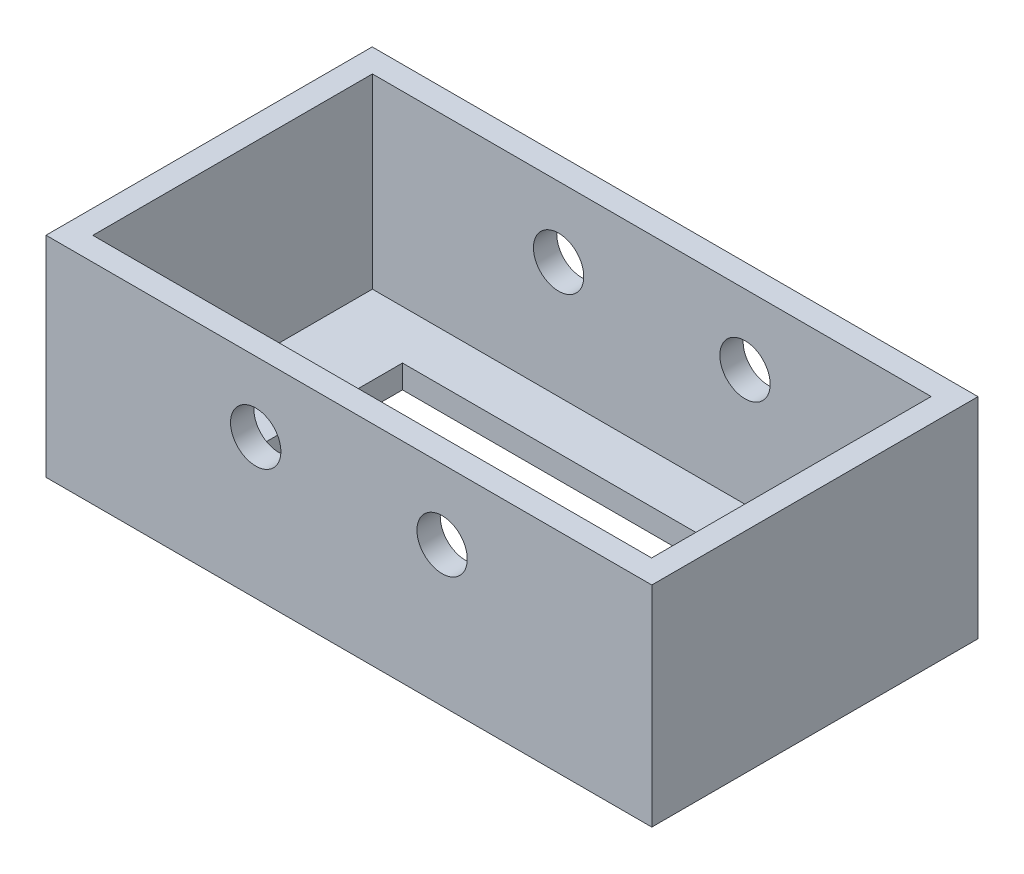
ISO-10303-21;
HEADER;
FILE_DESCRIPTION(('STEP AP214'),'2;1');
FILE_NAME('part.step','',(''),(''),'','','');
FILE_SCHEMA(('AUTOMOTIVE_DESIGN { 1 0 10303 214 1 1 1 1 }'));
ENDSEC;
DATA;
#1=APPLICATION_CONTEXT('core data for automotive mechanical design processes');
#2=APPLICATION_PROTOCOL_DEFINITION('international standard','automotive_design',2000,#1);
#3=PRODUCT_CONTEXT('',#1,'mechanical');
#4=PRODUCT('Part','Part','',(#3));
#5=PRODUCT_RELATED_PRODUCT_CATEGORY('part','',(#4));
#6=PRODUCT_DEFINITION_FORMATION('','',#4);
#7=PRODUCT_DEFINITION_CONTEXT('part definition',#1,'design');
#8=PRODUCT_DEFINITION('design','',#6,#7);
#9=PRODUCT_DEFINITION_SHAPE('','',#8);
#10=(LENGTH_UNIT() NAMED_UNIT(*) SI_UNIT(.MILLI.,.METRE.));
#11=(NAMED_UNIT(*) PLANE_ANGLE_UNIT() SI_UNIT($,.RADIAN.));
#12=(NAMED_UNIT(*) SI_UNIT($,.STERADIAN.) SOLID_ANGLE_UNIT());
#13=UNCERTAINTY_MEASURE_WITH_UNIT(LENGTH_MEASURE(1.E-05),#10,'distance_accuracy_value','');
#14=(GEOMETRIC_REPRESENTATION_CONTEXT(3) GLOBAL_UNCERTAINTY_ASSIGNED_CONTEXT((#13)) GLOBAL_UNIT_ASSIGNED_CONTEXT((#10,
#11,#12)) REPRESENTATION_CONTEXT('',''));
#15=CARTESIAN_POINT('',(0.,0.,0.));
#16=DIRECTION('',(0.,0.,1.));
#17=DIRECTION('',(1.,0.,0.));
#18=AXIS2_PLACEMENT_3D('',#15,#16,#17);
#19=CARTESIAN_POINT('',(0.,3.175,0.));
#20=DIRECTION('',(0.,-1.,0.));
#21=DIRECTION('',(0.,0.,-1.));
#22=AXIS2_PLACEMENT_3D('',#19,#20,#21);
#23=PLANE('',#22);
#24=DIRECTION('',(1.,0.,0.));
#25=VECTOR('',#24,1.);
#26=CARTESIAN_POINT('',(13.97,3.175,-9.8425));
#27=LINE('',#26,#25);
#28=CARTESIAN_POINT('',(13.97,3.175,-9.8425));
#29=VERTEX_POINT('',#28);
#30=CARTESIAN_POINT('',(68.58,3.175,-9.8425));
#31=VERTEX_POINT('',#30);
#32=EDGE_CURVE('E191',#29,#31,#27,.T.);
#33=ORIENTED_EDGE('',*,*,#32,.F.);
#34=DIRECTION('',(0.,0.,1.));
#35=VECTOR('',#34,1.);
#36=CARTESIAN_POINT('',(13.97,3.175,-34.6075));
#37=LINE('',#36,#35);
#38=CARTESIAN_POINT('',(13.97,3.175,-34.6075));
#39=VERTEX_POINT('',#38);
#40=EDGE_CURVE('E63',#39,#29,#37,.T.);
#41=ORIENTED_EDGE('',*,*,#40,.F.);
#42=DIRECTION('',(-1.,0.,0.));
#43=VECTOR('',#42,1.);
#44=CARTESIAN_POINT('',(13.97,3.175,-34.6075));
#45=LINE('',#44,#43);
#46=CARTESIAN_POINT('',(68.58,3.175,-34.6075));
#47=VERTEX_POINT('',#46);
#48=EDGE_CURVE('E176',#47,#39,#45,.T.);
#49=ORIENTED_EDGE('',*,*,#48,.F.);
#50=DIRECTION('',(0.,0.,-1.));
#51=VECTOR('',#50,1.);
#52=CARTESIAN_POINT('',(68.58,3.175,-34.6075));
#53=LINE('',#52,#51);
#54=EDGE_CURVE('E195',#31,#47,#53,.T.);
#55=ORIENTED_EDGE('',*,*,#54,.F.);
#56=EDGE_LOOP('',(#33,#41,#49,#55));
#57=FACE_BOUND('',#56,.T.);
#58=CARTESIAN_POINT('',(9.52499999999999,3.175,-22.225));
#59=DIRECTION('',(0.,1.,0.));
#60=DIRECTION('',(0.,0.,1.));
#61=AXIS2_PLACEMENT_3D('',#58,#59,#60);
#62=CIRCLE('',#61,2.54);
#63=CARTESIAN_POINT('',(9.52499999999999,3.175,-19.685));
#64=VERTEX_POINT('',#63);
#65=EDGE_CURVE('E219',#64,#64,#62,.T.);
#66=ORIENTED_EDGE('',*,*,#65,.F.);
#67=EDGE_LOOP('',(#66));
#68=FACE_BOUND('',#67,.T.);
#69=CARTESIAN_POINT('',(73.025,3.175,-22.225));
#70=DIRECTION('',(0.,1.,0.));
#71=DIRECTION('',(0.,0.,-1.));
#72=AXIS2_PLACEMENT_3D('',#69,#70,#71);
#73=CIRCLE('',#72,2.54000000000001);
#74=CARTESIAN_POINT('',(73.025,3.175,-24.765));
#75=VERTEX_POINT('',#74);
#76=EDGE_CURVE('E205',#75,#75,#73,.T.);
#77=ORIENTED_EDGE('',*,*,#76,.F.);
#78=EDGE_LOOP('',(#77));
#79=FACE_BOUND('',#78,.T.);
#80=DIRECTION('',(0.,0.,1.));
#81=VECTOR('',#80,1.);
#82=CARTESIAN_POINT('',(79.3457441530757,3.175,-41.275));
#83=LINE('',#82,#81);
#84=CARTESIAN_POINT('',(79.3457441530757,3.175,-41.275));
#85=VERTEX_POINT('',#84);
#86=CARTESIAN_POINT('',(79.3457441530757,3.175,-3.17500000000004));
#87=VERTEX_POINT('',#86);
#88=EDGE_CURVE('E135',#85,#87,#83,.T.);
#89=ORIENTED_EDGE('',*,*,#88,.F.);
#90=DIRECTION('',(1.,0.,0.));
#91=VECTOR('',#90,1.);
#92=CARTESIAN_POINT('',(0.,3.175,-41.275));
#93=LINE('',#92,#91);
#94=CARTESIAN_POINT('',(3.20425584692427,3.175,-41.275));
#95=VERTEX_POINT('',#94);
#96=EDGE_CURVE('E144',#95,#85,#93,.T.);
#97=ORIENTED_EDGE('',*,*,#96,.F.);
#98=DIRECTION('',(0.,0.,-1.));
#99=VECTOR('',#98,1.);
#100=CARTESIAN_POINT('',(3.20425584692427,3.175,-41.275));
#101=LINE('',#100,#99);
#102=CARTESIAN_POINT('',(3.20425584692427,3.175,-3.175));
#103=VERTEX_POINT('',#102);
#104=EDGE_CURVE('E146',#103,#95,#101,.T.);
#105=ORIENTED_EDGE('',*,*,#104,.F.);
#106=DIRECTION('',(-1.,0.,0.));
#107=VECTOR('',#106,1.);
#108=CARTESIAN_POINT('',(0.,3.175,-3.175));
#109=LINE('',#108,#107);
#110=EDGE_CURVE('E270',#87,#103,#109,.T.);
#111=ORIENTED_EDGE('',*,*,#110,.F.);
#112=EDGE_LOOP('',(#89,#97,#105,#111));
#113=FACE_BOUND('',#112,.T.);
#114=ADVANCED_FACE('F39',(#57,#68,#79,#113),#23,.F.);
#115=CARTESIAN_POINT('',(0.,28.575,-41.275));
#116=DIRECTION('',(0.,0.,-1.));
#117=DIRECTION('',(-1.,0.,0.));
#118=AXIS2_PLACEMENT_3D('',#115,#116,#117);
#119=PLANE('',#118);
#120=CARTESIAN_POINT('',(28.575,19.05,-41.275));
#121=DIRECTION('',(0.,0.,-1.));
#122=DIRECTION('',(-1.,0.,0.));
#123=AXIS2_PLACEMENT_3D('',#120,#121,#122);
#124=CIRCLE('',#123,3.429);
#125=CARTESIAN_POINT('',(25.146,19.05,-41.275));
#126=VERTEX_POINT('',#125);
#127=EDGE_CURVE('E290',#126,#126,#124,.T.);
#128=ORIENTED_EDGE('',*,*,#127,.T.);
#129=EDGE_LOOP('',(#128));
#130=FACE_BOUND('',#129,.T.);
#131=CARTESIAN_POINT('',(53.975,19.05,-41.275));
#132=DIRECTION('',(0.,0.,-1.));
#133=DIRECTION('',(-1.,0.,0.));
#134=AXIS2_PLACEMENT_3D('',#131,#132,#133);
#135=CIRCLE('',#134,3.429);
#136=CARTESIAN_POINT('',(50.546,19.05,-41.275));
#137=VERTEX_POINT('',#136);
#138=EDGE_CURVE('E299',#137,#137,#135,.T.);
#139=ORIENTED_EDGE('',*,*,#138,.T.);
#140=EDGE_LOOP('',(#139));
#141=FACE_BOUND('',#140,.T.);
#142=DIRECTION('',(0.,-1.,0.));
#143=VECTOR('',#142,1.);
#144=CARTESIAN_POINT('',(79.3457441530757,28.575,-41.275));
#145=LINE('',#144,#143);
#146=CARTESIAN_POINT('',(79.3457441530757,28.575,-41.275));
#147=VERTEX_POINT('',#146);
#148=EDGE_CURVE('E129',#147,#85,#145,.T.);
#149=ORIENTED_EDGE('',*,*,#148,.F.);
#150=DIRECTION('',(1.,0.,0.));
#151=VECTOR('',#150,1.);
#152=CARTESIAN_POINT('',(0.,28.575,-41.275));
#153=LINE('',#152,#151);
#154=CARTESIAN_POINT('',(3.20425584692427,28.575,-41.275));
#155=VERTEX_POINT('',#154);
#156=EDGE_CURVE('E142',#155,#147,#153,.T.);
#157=ORIENTED_EDGE('',*,*,#156,.F.);
#158=DIRECTION('',(0.,-1.,0.));
#159=VECTOR('',#158,1.);
#160=CARTESIAN_POINT('',(3.20425584692427,28.575,-41.275));
#161=LINE('',#160,#159);
#162=EDGE_CURVE('E280',#155,#95,#161,.T.);
#163=ORIENTED_EDGE('',*,*,#162,.T.);
#164=ORIENTED_EDGE('',*,*,#96,.T.);
#165=EDGE_LOOP('',(#149,#157,#163,#164));
#166=FACE_BOUND('',#165,.T.);
#167=ADVANCED_FACE('F140',(#130,#141,#166),#119,.F.);
#168=CARTESIAN_POINT('',(0.,28.575,-3.175));
#169=DIRECTION('',(0.,0.,1.));
#170=DIRECTION('',(1.,0.,0.));
#171=AXIS2_PLACEMENT_3D('',#168,#169,#170);
#172=PLANE('',#171);
#173=CARTESIAN_POINT('',(28.575,19.05,-3.175));
#174=DIRECTION('',(0.,0.,1.));
#175=DIRECTION('',(1.,0.,0.));
#176=AXIS2_PLACEMENT_3D('',#173,#174,#175);
#177=CIRCLE('',#176,3.429);
#178=CARTESIAN_POINT('',(32.004,19.05,-3.175));
#179=VERTEX_POINT('',#178);
#180=EDGE_CURVE('E295',#179,#179,#177,.T.);
#181=ORIENTED_EDGE('',*,*,#180,.T.);
#182=EDGE_LOOP('',(#181));
#183=FACE_BOUND('',#182,.T.);
#184=CARTESIAN_POINT('',(53.975,19.05,-3.175));
#185=DIRECTION('',(0.,0.,1.));
#186=DIRECTION('',(1.,0.,0.));
#187=AXIS2_PLACEMENT_3D('',#184,#185,#186);
#188=CIRCLE('',#187,3.429);
#189=CARTESIAN_POINT('',(57.404,19.05,-3.175));
#190=VERTEX_POINT('',#189);
#191=EDGE_CURVE('E303',#190,#190,#188,.T.);
#192=ORIENTED_EDGE('',*,*,#191,.T.);
#193=EDGE_LOOP('',(#192));
#194=FACE_BOUND('',#193,.T.);
#195=DIRECTION('',(0.,-1.,0.));
#196=VECTOR('',#195,1.);
#197=CARTESIAN_POINT('',(79.3457441530757,28.575,-3.17500000000004));
#198=LINE('',#197,#196);
#199=CARTESIAN_POINT('',(79.3457441530757,28.575,-3.175));
#200=VERTEX_POINT('',#199);
#201=EDGE_CURVE('E55',#200,#87,#198,.T.);
#202=ORIENTED_EDGE('',*,*,#201,.T.);
#203=ORIENTED_EDGE('',*,*,#110,.T.);
#204=DIRECTION('',(0.,-1.,0.));
#205=VECTOR('',#204,1.);
#206=CARTESIAN_POINT('',(3.20425584692427,28.575,-3.175));
#207=LINE('',#206,#205);
#208=CARTESIAN_POINT('',(3.20425584692427,28.575,-3.175));
#209=VERTEX_POINT('',#208);
#210=EDGE_CURVE('E275',#209,#103,#207,.T.);
#211=ORIENTED_EDGE('',*,*,#210,.F.);
#212=DIRECTION('',(-1.,0.,0.));
#213=VECTOR('',#212,1.);
#214=CARTESIAN_POINT('',(0.,28.575,-3.175));
#215=LINE('',#214,#213);
#216=EDGE_CURVE('E170',#200,#209,#215,.T.);
#217=ORIENTED_EDGE('',*,*,#216,.F.);
#218=EDGE_LOOP('',(#202,#203,#211,#217));
#219=FACE_BOUND('',#218,.T.);
#220=ADVANCED_FACE('F335',(#183,#194,#219),#172,.F.);
#221=CARTESIAN_POINT('',(0.,3.175,0.));
#222=DIRECTION('',(1.,0.,0.));
#223=DIRECTION('',(0.,0.,-1.));
#224=AXIS2_PLACEMENT_3D('',#221,#222,#223);
#225=PLANE('',#224);
#226=DIRECTION('',(0.,0.,1.));
#227=VECTOR('',#226,1.);
#228=CARTESIAN_POINT('',(0.,0.,0.));
#229=LINE('',#228,#227);
#230=CARTESIAN_POINT('',(0.,0.,-44.45));
#231=VERTEX_POINT('',#230);
#232=CARTESIAN_POINT('',(0.,0.,0.));
#233=VERTEX_POINT('',#232);
#234=EDGE_CURVE('E218',#231,#233,#229,.T.);
#235=ORIENTED_EDGE('',*,*,#234,.T.);
#236=DIRECTION('',(0.,-1.,0.));
#237=VECTOR('',#236,1.);
#238=CARTESIAN_POINT('',(0.,3.175,0.));
#239=LINE('',#238,#237);
#240=CARTESIAN_POINT('',(0.,28.575,0.));
#241=VERTEX_POINT('',#240);
#242=EDGE_CURVE('E11',#241,#233,#239,.T.);
#243=ORIENTED_EDGE('',*,*,#242,.F.);
#244=DIRECTION('',(0.,0.,1.));
#245=VECTOR('',#244,1.);
#246=CARTESIAN_POINT('',(0.,28.575,-44.45));
#247=LINE('',#246,#245);
#248=CARTESIAN_POINT('',(0.,28.575,-44.45));
#249=VERTEX_POINT('',#248);
#250=EDGE_CURVE('E155',#249,#241,#247,.T.);
#251=ORIENTED_EDGE('',*,*,#250,.F.);
#252=DIRECTION('',(0.,-1.,0.));
#253=VECTOR('',#252,1.);
#254=CARTESIAN_POINT('',(0.,3.175,-44.45));
#255=LINE('',#254,#253);
#256=EDGE_CURVE('E242',#249,#231,#255,.T.);
#257=ORIENTED_EDGE('',*,*,#256,.T.);
#258=EDGE_LOOP('',(#235,#243,#251,#257));
#259=FACE_BOUND('',#258,.T.);
#260=ADVANCED_FACE('F41',(#259),#225,.F.);
#261=CARTESIAN_POINT('',(0.,3.175,0.));
#262=DIRECTION('',(0.,0.,-1.));
#263=DIRECTION('',(-1.,0.,0.));
#264=AXIS2_PLACEMENT_3D('',#261,#262,#263);
#265=PLANE('',#264);
#266=CARTESIAN_POINT('',(28.575,19.05,0.));
#267=DIRECTION('',(0.,0.,-1.));
#268=DIRECTION('',(-1.,0.,0.));
#269=AXIS2_PLACEMENT_3D('',#266,#267,#268);
#270=CIRCLE('',#269,3.429);
#271=CARTESIAN_POINT('',(25.146,19.05,0.));
#272=VERTEX_POINT('',#271);
#273=EDGE_CURVE('E307',#272,#272,#270,.T.);
#274=ORIENTED_EDGE('',*,*,#273,.T.);
#275=EDGE_LOOP('',(#274));
#276=FACE_BOUND('',#275,.T.);
#277=CARTESIAN_POINT('',(53.975,19.05,0.));
#278=DIRECTION('',(0.,0.,-1.));
#279=DIRECTION('',(-1.,0.,0.));
#280=AXIS2_PLACEMENT_3D('',#277,#278,#279);
#281=CIRCLE('',#280,3.429);
#282=CARTESIAN_POINT('',(50.546,19.05,0.));
#283=VERTEX_POINT('',#282);
#284=EDGE_CURVE('E312',#283,#283,#281,.T.);
#285=ORIENTED_EDGE('',*,*,#284,.T.);
#286=EDGE_LOOP('',(#285));
#287=FACE_BOUND('',#286,.T.);
#288=DIRECTION('',(1.,0.,0.));
#289=VECTOR('',#288,1.);
#290=CARTESIAN_POINT('',(0.,0.,0.));
#291=LINE('',#290,#289);
#292=CARTESIAN_POINT('',(82.55,0.,0.));
#293=VERTEX_POINT('',#292);
#294=EDGE_CURVE('E233',#233,#293,#291,.T.);
#295=ORIENTED_EDGE('',*,*,#294,.T.);
#296=DIRECTION('',(0.,-1.,0.));
#297=VECTOR('',#296,1.);
#298=CARTESIAN_POINT('',(82.55,3.175,0.));
#299=LINE('',#298,#297);
#300=CARTESIAN_POINT('',(82.55,28.575,0.));
#301=VERTEX_POINT('',#300);
#302=EDGE_CURVE('E48',#301,#293,#299,.T.);
#303=ORIENTED_EDGE('',*,*,#302,.F.);
#304=DIRECTION('',(1.,0.,0.));
#305=VECTOR('',#304,1.);
#306=CARTESIAN_POINT('',(0.,28.575,0.));
#307=LINE('',#306,#305);
#308=EDGE_CURVE('E268',#241,#301,#307,.T.);
#309=ORIENTED_EDGE('',*,*,#308,.F.);
#310=ORIENTED_EDGE('',*,*,#242,.T.);
#311=EDGE_LOOP('',(#295,#303,#309,#310));
#312=FACE_BOUND('',#311,.T.);
#313=ADVANCED_FACE('F324',(#276,#287,#312),#265,.F.);
#314=CARTESIAN_POINT('',(82.55,3.175,0.));
#315=DIRECTION('',(-1.,0.,0.));
#316=DIRECTION('',(0.,0.,1.));
#317=AXIS2_PLACEMENT_3D('',#314,#315,#316);
#318=PLANE('',#317);
#319=DIRECTION('',(0.,0.,-1.));
#320=VECTOR('',#319,1.);
#321=CARTESIAN_POINT('',(82.55,0.,0.));
#322=LINE('',#321,#320);
#323=CARTESIAN_POINT('',(82.55,0.,-44.45));
#324=VERTEX_POINT('',#323);
#325=EDGE_CURVE('E236',#293,#324,#322,.T.);
#326=ORIENTED_EDGE('',*,*,#325,.T.);
#327=DIRECTION('',(0.,-1.,0.));
#328=VECTOR('',#327,1.);
#329=CARTESIAN_POINT('',(82.55,3.175,-44.45));
#330=LINE('',#329,#328);
#331=CARTESIAN_POINT('',(82.55,28.575,-44.45));
#332=VERTEX_POINT('',#331);
#333=EDGE_CURVE('E246',#332,#324,#330,.T.);
#334=ORIENTED_EDGE('',*,*,#333,.F.);
#335=DIRECTION('',(0.,0.,-1.));
#336=VECTOR('',#335,1.);
#337=CARTESIAN_POINT('',(82.55,28.575,-44.45));
#338=LINE('',#337,#336);
#339=EDGE_CURVE('E154',#301,#332,#338,.T.);
#340=ORIENTED_EDGE('',*,*,#339,.F.);
#341=ORIENTED_EDGE('',*,*,#302,.T.);
#342=EDGE_LOOP('',(#326,#334,#340,#341));
#343=FACE_BOUND('',#342,.T.);
#344=ADVANCED_FACE('F254',(#343),#318,.F.);
#345=CARTESIAN_POINT('',(0.,3.175,-44.45));
#346=DIRECTION('',(0.,0.,1.));
#347=DIRECTION('',(1.,0.,0.));
#348=AXIS2_PLACEMENT_3D('',#345,#346,#347);
#349=PLANE('',#348);
#350=CARTESIAN_POINT('',(28.575,19.05,-44.45));
#351=DIRECTION('',(0.,0.,-1.));
#352=DIRECTION('',(-1.,0.,0.));
#353=AXIS2_PLACEMENT_3D('',#350,#351,#352);
#354=CIRCLE('',#353,3.429);
#355=CARTESIAN_POINT('',(25.146,19.05,-44.45));
#356=VERTEX_POINT('',#355);
#357=EDGE_CURVE('E316',#356,#356,#354,.T.);
#358=ORIENTED_EDGE('',*,*,#357,.F.);
#359=EDGE_LOOP('',(#358));
#360=FACE_BOUND('',#359,.T.);
#361=CARTESIAN_POINT('',(53.975,19.05,-44.45));
#362=DIRECTION('',(0.,0.,-1.));
#363=DIRECTION('',(-1.,0.,0.));
#364=AXIS2_PLACEMENT_3D('',#361,#362,#363);
#365=CIRCLE('',#364,3.429);
#366=CARTESIAN_POINT('',(50.546,19.05,-44.45));
#367=VERTEX_POINT('',#366);
#368=EDGE_CURVE('E308',#367,#367,#365,.T.);
#369=ORIENTED_EDGE('',*,*,#368,.F.);
#370=EDGE_LOOP('',(#369));
#371=FACE_BOUND('',#370,.T.);
#372=DIRECTION('',(-1.,0.,0.));
#373=VECTOR('',#372,1.);
#374=CARTESIAN_POINT('',(0.,0.,-44.45));
#375=LINE('',#374,#373);
#376=EDGE_CURVE('E239',#324,#231,#375,.T.);
#377=ORIENTED_EDGE('',*,*,#376,.T.);
#378=ORIENTED_EDGE('',*,*,#256,.F.);
#379=DIRECTION('',(-1.,0.,0.));
#380=VECTOR('',#379,1.);
#381=CARTESIAN_POINT('',(0.,28.575,-44.45));
#382=LINE('',#381,#380);
#383=EDGE_CURVE('E160',#332,#249,#382,.T.);
#384=ORIENTED_EDGE('',*,*,#383,.F.);
#385=ORIENTED_EDGE('',*,*,#333,.T.);
#386=EDGE_LOOP('',(#377,#378,#384,#385));
#387=FACE_BOUND('',#386,.T.);
#388=ADVANCED_FACE('F263',(#360,#371,#387),#349,.F.);
#389=CARTESIAN_POINT('',(0.,0.,0.));
#390=DIRECTION('',(0.,-1.,0.));
#391=DIRECTION('',(0.,0.,-1.));
#392=AXIS2_PLACEMENT_3D('',#389,#390,#391);
#393=PLANE('',#392);
#394=DIRECTION('',(0.,0.,1.));
#395=VECTOR('',#394,1.);
#396=CARTESIAN_POINT('',(13.97,0.,-34.6075));
#397=LINE('',#396,#395);
#398=CARTESIAN_POINT('',(13.97,0.,-34.6075));
#399=VERTEX_POINT('',#398);
#400=CARTESIAN_POINT('',(13.97,0.,-9.8425));
#401=VERTEX_POINT('',#400);
#402=EDGE_CURVE('E171',#399,#401,#397,.T.);
#403=ORIENTED_EDGE('',*,*,#402,.T.);
#404=DIRECTION('',(1.,0.,0.));
#405=VECTOR('',#404,1.);
#406=CARTESIAN_POINT('',(13.97,0.,-9.8425));
#407=LINE('',#406,#405);
#408=CARTESIAN_POINT('',(68.58,0.,-9.8425));
#409=VERTEX_POINT('',#408);
#410=EDGE_CURVE('E175',#401,#409,#407,.T.);
#411=ORIENTED_EDGE('',*,*,#410,.T.);
#412=DIRECTION('',(0.,0.,-1.));
#413=VECTOR('',#412,1.);
#414=CARTESIAN_POINT('',(68.58,0.,-34.6075));
#415=LINE('',#414,#413);
#416=CARTESIAN_POINT('',(68.58,0.,-34.6075));
#417=VERTEX_POINT('',#416);
#418=EDGE_CURVE('E180',#409,#417,#415,.T.);
#419=ORIENTED_EDGE('',*,*,#418,.T.);
#420=DIRECTION('',(-1.,0.,0.));
#421=VECTOR('',#420,1.);
#422=CARTESIAN_POINT('',(13.97,0.,-34.6075));
#423=LINE('',#422,#421);
#424=EDGE_CURVE('E184',#417,#399,#423,.T.);
#425=ORIENTED_EDGE('',*,*,#424,.T.);
#426=EDGE_LOOP('',(#403,#411,#419,#425));
#427=FACE_BOUND('',#426,.T.);
#428=CARTESIAN_POINT('',(9.52499999999999,0.,-22.225));
#429=DIRECTION('',(0.,1.,0.));
#430=DIRECTION('',(0.,0.,1.));
#431=AXIS2_PLACEMENT_3D('',#428,#429,#430);
#432=CIRCLE('',#431,2.54);
#433=CARTESIAN_POINT('',(9.52499999999999,0.,-19.685));
#434=VERTEX_POINT('',#433);
#435=EDGE_CURVE('E214',#434,#434,#432,.T.);
#436=ORIENTED_EDGE('',*,*,#435,.T.);
#437=EDGE_LOOP('',(#436));
#438=FACE_BOUND('',#437,.T.);
#439=CARTESIAN_POINT('',(73.025,0.,-22.225));
#440=DIRECTION('',(0.,1.,0.));
#441=DIRECTION('',(0.,0.,-1.));
#442=AXIS2_PLACEMENT_3D('',#439,#440,#441);
#443=CIRCLE('',#442,2.54000000000001);
#444=CARTESIAN_POINT('',(73.025,0.,-24.765));
#445=VERTEX_POINT('',#444);
#446=EDGE_CURVE('E223',#445,#445,#443,.T.);
#447=ORIENTED_EDGE('',*,*,#446,.T.);
#448=EDGE_LOOP('',(#447));
#449=FACE_BOUND('',#448,.T.);
#450=ORIENTED_EDGE('',*,*,#234,.F.);
#451=ORIENTED_EDGE('',*,*,#376,.F.);
#452=ORIENTED_EDGE('',*,*,#325,.F.);
#453=ORIENTED_EDGE('',*,*,#294,.F.);
#454=EDGE_LOOP('',(#450,#451,#452,#453));
#455=FACE_BOUND('',#454,.T.);
#456=ADVANCED_FACE('F261',(#427,#438,#449,#455),#393,.T.);
#457=CARTESIAN_POINT('',(73.025,0.,-22.225));
#458=DIRECTION('',(0.,1.,0.));
#459=DIRECTION('',(0.,0.,1.));
#460=AXIS2_PLACEMENT_3D('',#457,#458,#459);
#461=CYLINDRICAL_SURFACE('',#460,2.54000000000001);
#462=ORIENTED_EDGE('',*,*,#446,.F.);
#463=EDGE_LOOP('',(#462));
#464=FACE_BOUND('',#463,.T.);
#465=ORIENTED_EDGE('',*,*,#76,.T.);
#466=EDGE_LOOP('',(#465));
#467=FACE_BOUND('',#466,.T.);
#468=ADVANCED_FACE('F369',(#464,#467),#461,.F.);
#469=CARTESIAN_POINT('',(9.52499999999999,0.,-22.225));
#470=DIRECTION('',(0.,1.,0.));
#471=DIRECTION('',(0.,0.,1.));
#472=AXIS2_PLACEMENT_3D('',#469,#470,#471);
#473=CYLINDRICAL_SURFACE('',#472,2.54);
#474=ORIENTED_EDGE('',*,*,#435,.F.);
#475=EDGE_LOOP('',(#474));
#476=FACE_BOUND('',#475,.T.);
#477=ORIENTED_EDGE('',*,*,#65,.T.);
#478=EDGE_LOOP('',(#477));
#479=FACE_BOUND('',#478,.T.);
#480=ADVANCED_FACE('F439',(#476,#479),#473,.F.);
#481=CARTESIAN_POINT('',(13.97,0.,-34.6075));
#482=DIRECTION('',(-1.,0.,0.));
#483=DIRECTION('',(0.,0.,1.));
#484=AXIS2_PLACEMENT_3D('',#481,#482,#483);
#485=PLANE('',#484);
#486=ORIENTED_EDGE('',*,*,#40,.T.);
#487=DIRECTION('',(0.,1.,0.));
#488=VECTOR('',#487,1.);
#489=CARTESIAN_POINT('',(13.97,0.,-9.8425));
#490=LINE('',#489,#488);
#491=EDGE_CURVE('E188',#401,#29,#490,.T.);
#492=ORIENTED_EDGE('',*,*,#491,.F.);
#493=ORIENTED_EDGE('',*,*,#402,.F.);
#494=DIRECTION('',(0.,1.,0.));
#495=VECTOR('',#494,1.);
#496=CARTESIAN_POINT('',(13.97,0.,-34.6075));
#497=LINE('',#496,#495);
#498=EDGE_CURVE('E202',#399,#39,#497,.T.);
#499=ORIENTED_EDGE('',*,*,#498,.T.);
#500=EDGE_LOOP('',(#486,#492,#493,#499));
#501=FACE_BOUND('',#500,.T.);
#502=ADVANCED_FACE('F445',(#501),#485,.F.);
#503=CARTESIAN_POINT('',(13.97,0.,-34.6075));
#504=DIRECTION('',(0.,0.,-1.));
#505=DIRECTION('',(-1.,0.,0.));
#506=AXIS2_PLACEMENT_3D('',#503,#504,#505);
#507=PLANE('',#506);
#508=ORIENTED_EDGE('',*,*,#48,.T.);
#509=ORIENTED_EDGE('',*,*,#498,.F.);
#510=ORIENTED_EDGE('',*,*,#424,.F.);
#511=DIRECTION('',(0.,1.,0.));
#512=VECTOR('',#511,1.);
#513=CARTESIAN_POINT('',(68.58,0.,-34.6075));
#514=LINE('',#513,#512);
#515=EDGE_CURVE('E206',#417,#47,#514,.T.);
#516=ORIENTED_EDGE('',*,*,#515,.T.);
#517=EDGE_LOOP('',(#508,#509,#510,#516));
#518=FACE_BOUND('',#517,.T.);
#519=ADVANCED_FACE('F451',(#518),#507,.F.);
#520=CARTESIAN_POINT('',(68.58,0.,-34.6075));
#521=DIRECTION('',(1.,0.,0.));
#522=DIRECTION('',(0.,0.,-1.));
#523=AXIS2_PLACEMENT_3D('',#520,#521,#522);
#524=PLANE('',#523);
#525=ORIENTED_EDGE('',*,*,#54,.T.);
#526=ORIENTED_EDGE('',*,*,#515,.F.);
#527=ORIENTED_EDGE('',*,*,#418,.F.);
#528=DIRECTION('',(0.,1.,0.));
#529=VECTOR('',#528,1.);
#530=CARTESIAN_POINT('',(68.58,0.,-9.8425));
#531=LINE('',#530,#529);
#532=EDGE_CURVE('E209',#409,#31,#531,.T.);
#533=ORIENTED_EDGE('',*,*,#532,.T.);
#534=EDGE_LOOP('',(#525,#526,#527,#533));
#535=FACE_BOUND('',#534,.T.);
#536=ADVANCED_FACE('F458',(#535),#524,.F.);
#537=CARTESIAN_POINT('',(13.97,0.,-9.8425));
#538=DIRECTION('',(0.,0.,1.));
#539=DIRECTION('',(1.,0.,0.));
#540=AXIS2_PLACEMENT_3D('',#537,#538,#539);
#541=PLANE('',#540);
#542=ORIENTED_EDGE('',*,*,#32,.T.);
#543=ORIENTED_EDGE('',*,*,#532,.F.);
#544=ORIENTED_EDGE('',*,*,#410,.F.);
#545=ORIENTED_EDGE('',*,*,#491,.T.);
#546=EDGE_LOOP('',(#542,#543,#544,#545));
#547=FACE_BOUND('',#546,.T.);
#548=ADVANCED_FACE('F355',(#547),#541,.F.);
#549=CARTESIAN_POINT('',(0.,28.575,0.));
#550=DIRECTION('',(0.,1.,0.));
#551=DIRECTION('',(0.,0.,1.));
#552=AXIS2_PLACEMENT_3D('',#549,#550,#551);
#553=PLANE('',#552);
#554=ORIENTED_EDGE('',*,*,#156,.T.);
#555=DIRECTION('',(0.,0.,1.));
#556=VECTOR('',#555,1.);
#557=CARTESIAN_POINT('',(79.3457441530757,28.575,-41.275));
#558=LINE('',#557,#556);
#559=EDGE_CURVE('E126',#147,#200,#558,.T.);
#560=ORIENTED_EDGE('',*,*,#559,.T.);
#561=ORIENTED_EDGE('',*,*,#216,.T.);
#562=DIRECTION('',(0.,0.,-1.));
#563=VECTOR('',#562,1.);
#564=CARTESIAN_POINT('',(3.20425584692427,28.575,-41.275));
#565=LINE('',#564,#563);
#566=EDGE_CURVE('E151',#209,#155,#565,.T.);
#567=ORIENTED_EDGE('',*,*,#566,.T.);
#568=EDGE_LOOP('',(#554,#560,#561,#567));
#569=FACE_BOUND('',#568,.T.);
#570=ORIENTED_EDGE('',*,*,#250,.T.);
#571=ORIENTED_EDGE('',*,*,#308,.T.);
#572=ORIENTED_EDGE('',*,*,#339,.T.);
#573=ORIENTED_EDGE('',*,*,#383,.T.);
#574=EDGE_LOOP('',(#570,#571,#572,#573));
#575=FACE_BOUND('',#574,.T.);
#576=ADVANCED_FACE('F148',(#569,#575),#553,.T.);
#577=CARTESIAN_POINT('',(3.20425584692427,28.575,-41.275));
#578=DIRECTION('',(-1.,0.,0.));
#579=DIRECTION('',(0.,0.,1.));
#580=AXIS2_PLACEMENT_3D('',#577,#578,#579);
#581=PLANE('',#580);
#582=ORIENTED_EDGE('',*,*,#104,.T.);
#583=ORIENTED_EDGE('',*,*,#162,.F.);
#584=ORIENTED_EDGE('',*,*,#566,.F.);
#585=ORIENTED_EDGE('',*,*,#210,.T.);
#586=EDGE_LOOP('',(#582,#583,#584,#585));
#587=FACE_BOUND('',#586,.T.);
#588=ADVANCED_FACE('F346',(#587),#581,.F.);
#589=CARTESIAN_POINT('',(79.3457441530757,28.575,-41.275));
#590=DIRECTION('',(1.,0.,0.));
#591=DIRECTION('',(0.,0.,-1.));
#592=AXIS2_PLACEMENT_3D('',#589,#590,#591);
#593=PLANE('',#592);
#594=ORIENTED_EDGE('',*,*,#88,.T.);
#595=ORIENTED_EDGE('',*,*,#201,.F.);
#596=ORIENTED_EDGE('',*,*,#559,.F.);
#597=ORIENTED_EDGE('',*,*,#148,.T.);
#598=EDGE_LOOP('',(#594,#595,#596,#597));
#599=FACE_BOUND('',#598,.T.);
#600=ADVANCED_FACE('F128',(#599),#593,.F.);
#601=CARTESIAN_POINT('',(53.975,19.05,0.));
#602=DIRECTION('',(0.,0.,-1.));
#603=DIRECTION('',(-1.,0.,0.));
#604=AXIS2_PLACEMENT_3D('',#601,#602,#603);
#605=CYLINDRICAL_SURFACE('',#604,3.429);
#606=ORIENTED_EDGE('',*,*,#368,.T.);
#607=EDGE_LOOP('',(#606));
#608=FACE_BOUND('',#607,.T.);
#609=ORIENTED_EDGE('',*,*,#138,.F.);
#610=EDGE_LOOP('',(#609));
#611=FACE_BOUND('',#610,.T.);
#612=ADVANCED_FACE('F353',(#608,#611),#605,.F.);
#613=CARTESIAN_POINT('',(28.575,19.05,0.));
#614=DIRECTION('',(0.,0.,-1.));
#615=DIRECTION('',(-1.,0.,0.));
#616=AXIS2_PLACEMENT_3D('',#613,#614,#615);
#617=CYLINDRICAL_SURFACE('',#616,3.429);
#618=ORIENTED_EDGE('',*,*,#357,.T.);
#619=EDGE_LOOP('',(#618));
#620=FACE_BOUND('',#619,.T.);
#621=ORIENTED_EDGE('',*,*,#127,.F.);
#622=EDGE_LOOP('',(#621));
#623=FACE_BOUND('',#622,.T.);
#624=ADVANCED_FACE('F332',(#620,#623),#617,.F.);
#625=ORIENTED_EDGE('',*,*,#284,.F.);
#626=EDGE_LOOP('',(#625));
#627=FACE_BOUND('',#626,.T.);
#628=ORIENTED_EDGE('',*,*,#191,.F.);
#629=EDGE_LOOP('',(#628));
#630=FACE_BOUND('',#629,.T.);
#631=ADVANCED_FACE('F330',(#627,#630),#605,.F.);
#632=ORIENTED_EDGE('',*,*,#273,.F.);
#633=EDGE_LOOP('',(#632));
#634=FACE_BOUND('',#633,.T.);
#635=ORIENTED_EDGE('',*,*,#180,.F.);
#636=EDGE_LOOP('',(#635));
#637=FACE_BOUND('',#636,.T.);
#638=ADVANCED_FACE('F327',(#634,#637),#617,.F.);
#639=CLOSED_SHELL('',(#114,#167,#220,#260,#313,#344,#388,#456,#468,#480,#502,#519,#536,#548,
#576,#588,#600,#612,#624,#631,#638));
#640=MANIFOLD_SOLID_BREP('B2',#639);
#641=ADVANCED_BREP_SHAPE_REPRESENTATION('',(#18,#640),#14);
#642=SHAPE_DEFINITION_REPRESENTATION(#9,#641);
ENDSEC;
END-ISO-10303-21;
